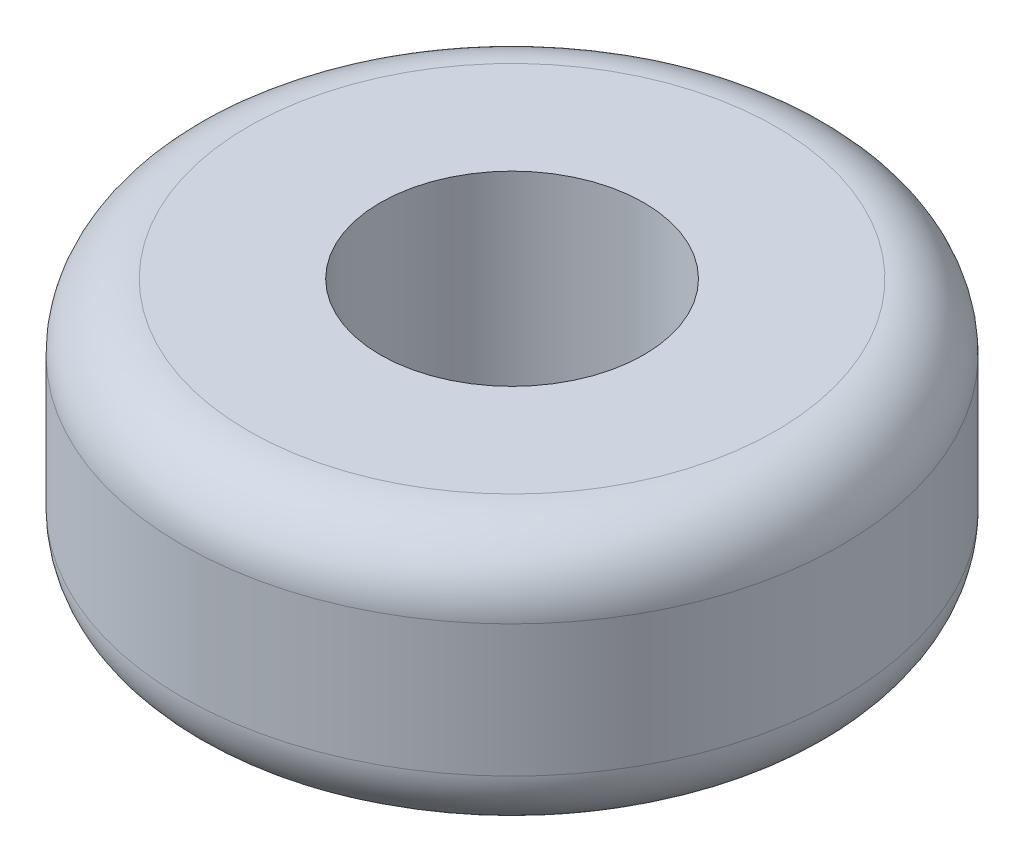
ISO-10303-21;
HEADER;
FILE_DESCRIPTION(('STEP AP214'),'2;1');
FILE_NAME('part.step','',(''),(''),'','','');
FILE_SCHEMA(('AUTOMOTIVE_DESIGN { 1 0 10303 214 1 1 1 1 }'));
ENDSEC;
DATA;
#1=APPLICATION_CONTEXT('core data for automotive mechanical design processes');
#2=APPLICATION_PROTOCOL_DEFINITION('international standard','automotive_design',2000,#1);
#3=PRODUCT_CONTEXT('',#1,'mechanical');
#4=PRODUCT('Part','Part','',(#3));
#5=PRODUCT_RELATED_PRODUCT_CATEGORY('part','',(#4));
#6=PRODUCT_DEFINITION_FORMATION('','',#4);
#7=PRODUCT_DEFINITION_CONTEXT('part definition',#1,'design');
#8=PRODUCT_DEFINITION('design','',#6,#7);
#9=PRODUCT_DEFINITION_SHAPE('','',#8);
#10=(LENGTH_UNIT() NAMED_UNIT(*) SI_UNIT(.MILLI.,.METRE.));
#11=(NAMED_UNIT(*) PLANE_ANGLE_UNIT() SI_UNIT($,.RADIAN.));
#12=(NAMED_UNIT(*) SI_UNIT($,.STERADIAN.) SOLID_ANGLE_UNIT());
#13=UNCERTAINTY_MEASURE_WITH_UNIT(LENGTH_MEASURE(1.E-05),#10,'distance_accuracy_value','');
#14=(GEOMETRIC_REPRESENTATION_CONTEXT(3) GLOBAL_UNCERTAINTY_ASSIGNED_CONTEXT((#13)) GLOBAL_UNIT_ASSIGNED_CONTEXT((#10,
#11,#12)) REPRESENTATION_CONTEXT('',''));
#15=CARTESIAN_POINT('',(0.,0.,0.));
#16=DIRECTION('',(0.,0.,1.));
#17=DIRECTION('',(1.,0.,0.));
#18=AXIS2_PLACEMENT_3D('',#15,#16,#17);
#19=CARTESIAN_POINT('',(0.,25.4,0.));
#20=DIRECTION('',(0.,-1.,0.));
#21=DIRECTION('',(0.,0.,-1.));
#22=AXIS2_PLACEMENT_3D('',#19,#20,#21);
#23=CYLINDRICAL_SURFACE('',#22,31.75);
#24=CARTESIAN_POINT('',(0.,6.35,0.));
#25=DIRECTION('',(0.,1.,0.));
#26=DIRECTION('',(0.,0.,1.));
#27=AXIS2_PLACEMENT_3D('',#24,#25,#26);
#28=CIRCLE('',#27,31.75);
#29=CARTESIAN_POINT('',(0.,6.35,31.75));
#30=VERTEX_POINT('',#29);
#31=EDGE_CURVE('E56',#30,#30,#28,.T.);
#32=ORIENTED_EDGE('',*,*,#31,.T.);
#33=EDGE_LOOP('',(#32));
#34=FACE_BOUND('',#33,.T.);
#35=CARTESIAN_POINT('',(0.,19.05,0.));
#36=DIRECTION('',(0.,1.,0.));
#37=DIRECTION('',(0.,0.,1.));
#38=AXIS2_PLACEMENT_3D('',#35,#36,#37);
#39=CIRCLE('',#38,31.75);
#40=CARTESIAN_POINT('',(0.,19.05,31.75));
#41=VERTEX_POINT('',#40);
#42=EDGE_CURVE('E61',#41,#41,#39,.F.);
#43=ORIENTED_EDGE('',*,*,#42,.T.);
#44=EDGE_LOOP('',(#43));
#45=FACE_BOUND('',#44,.T.);
#46=ADVANCED_FACE('F43',(#34,#45),#23,.T.);
#47=CARTESIAN_POINT('',(0.,25.4,0.));
#48=DIRECTION('',(0.,1.,0.));
#49=DIRECTION('',(0.,0.,1.));
#50=AXIS2_PLACEMENT_3D('',#47,#48,#49);
#51=PLANE('',#50);
#52=CARTESIAN_POINT('',(0.,25.4,0.));
#53=DIRECTION('',(0.,1.,0.));
#54=DIRECTION('',(0.,0.,1.));
#55=AXIS2_PLACEMENT_3D('',#52,#53,#54);
#56=CIRCLE('',#55,25.4);
#57=CARTESIAN_POINT('',(0.,25.4,25.4));
#58=VERTEX_POINT('',#57);
#59=EDGE_CURVE('E10',#58,#58,#56,.T.);
#60=ORIENTED_EDGE('',*,*,#59,.T.);
#61=EDGE_LOOP('',(#60));
#62=FACE_BOUND('',#61,.T.);
#63=CARTESIAN_POINT('',(0.,25.4,0.));
#64=DIRECTION('',(0.,1.,0.));
#65=DIRECTION('',(0.,0.,1.));
#66=AXIS2_PLACEMENT_3D('',#63,#64,#65);
#67=CIRCLE('',#66,12.7);
#68=CARTESIAN_POINT('',(0.,25.4,12.7));
#69=VERTEX_POINT('',#68);
#70=EDGE_CURVE('E68',#69,#69,#67,.T.);
#71=ORIENTED_EDGE('',*,*,#70,.F.);
#72=EDGE_LOOP('',(#71));
#73=FACE_BOUND('',#72,.T.);
#74=ADVANCED_FACE('F85',(#62,#73),#51,.T.);
#75=CARTESIAN_POINT('',(0.,0.,0.));
#76=DIRECTION('',(0.,1.,0.));
#77=DIRECTION('',(0.,0.,1.));
#78=AXIS2_PLACEMENT_3D('',#75,#76,#77);
#79=PLANE('',#78);
#80=CARTESIAN_POINT('',(0.,0.,0.));
#81=DIRECTION('',(0.,1.,0.));
#82=DIRECTION('',(0.,0.,1.));
#83=AXIS2_PLACEMENT_3D('',#80,#81,#82);
#84=CIRCLE('',#83,25.4);
#85=CARTESIAN_POINT('',(0.,0.,25.4));
#86=VERTEX_POINT('',#85);
#87=EDGE_CURVE('E51',#86,#86,#84,.F.);
#88=ORIENTED_EDGE('',*,*,#87,.T.);
#89=EDGE_LOOP('',(#88));
#90=FACE_BOUND('',#89,.T.);
#91=CARTESIAN_POINT('',(0.,0.,0.));
#92=DIRECTION('',(0.,1.,0.));
#93=DIRECTION('',(0.,0.,1.));
#94=AXIS2_PLACEMENT_3D('',#91,#92,#93);
#95=CIRCLE('',#94,12.7);
#96=CARTESIAN_POINT('',(0.,0.,12.7));
#97=VERTEX_POINT('',#96);
#98=EDGE_CURVE('E67',#97,#97,#95,.T.);
#99=ORIENTED_EDGE('',*,*,#98,.T.);
#100=EDGE_LOOP('',(#99));
#101=FACE_BOUND('',#100,.T.);
#102=ADVANCED_FACE('F76',(#90,#101),#79,.F.);
#103=CARTESIAN_POINT('',(0.,0.,0.));
#104=DIRECTION('',(0.,1.,0.));
#105=DIRECTION('',(0.,0.,1.));
#106=AXIS2_PLACEMENT_3D('',#103,#104,#105);
#107=CYLINDRICAL_SURFACE('',#106,12.7);
#108=ORIENTED_EDGE('',*,*,#98,.F.);
#109=EDGE_LOOP('',(#108));
#110=FACE_BOUND('',#109,.T.);
#111=ORIENTED_EDGE('',*,*,#70,.T.);
#112=EDGE_LOOP('',(#111));
#113=FACE_BOUND('',#112,.T.);
#114=ADVANCED_FACE('F78',(#110,#113),#107,.F.);
#115=CARTESIAN_POINT('',(0.,6.35,0.));
#116=DIRECTION('',(0.,1.,0.));
#117=DIRECTION('',(0.,0.,1.));
#118=AXIS2_PLACEMENT_3D('',#115,#116,#117);
#119=TOROIDAL_SURFACE('',#118,25.4,6.35);
#120=ORIENTED_EDGE('',*,*,#87,.F.);
#121=EDGE_LOOP('',(#120));
#122=FACE_BOUND('',#121,.T.);
#123=ORIENTED_EDGE('',*,*,#31,.F.);
#124=EDGE_LOOP('',(#123));
#125=FACE_BOUND('',#124,.T.);
#126=ADVANCED_FACE('F81',(#122,#125),#119,.T.);
#127=CARTESIAN_POINT('',(0.,19.05,0.));
#128=DIRECTION('',(0.,1.,0.));
#129=DIRECTION('',(0.,0.,1.));
#130=AXIS2_PLACEMENT_3D('',#127,#128,#129);
#131=TOROIDAL_SURFACE('',#130,25.4,6.35);
#132=ORIENTED_EDGE('',*,*,#42,.F.);
#133=EDGE_LOOP('',(#132));
#134=FACE_BOUND('',#133,.T.);
#135=ORIENTED_EDGE('',*,*,#59,.F.);
#136=EDGE_LOOP('',(#135));
#137=FACE_BOUND('',#136,.T.);
#138=ADVANCED_FACE('F45',(#134,#137),#131,.T.);
#139=CLOSED_SHELL('',(#46,#74,#102,#114,#126,#138));
#140=MANIFOLD_SOLID_BREP('B2',#139);
#141=ADVANCED_BREP_SHAPE_REPRESENTATION('',(#18,#140),#14);
#142=SHAPE_DEFINITION_REPRESENTATION(#9,#141);
ENDSEC;
END-ISO-10303-21;
